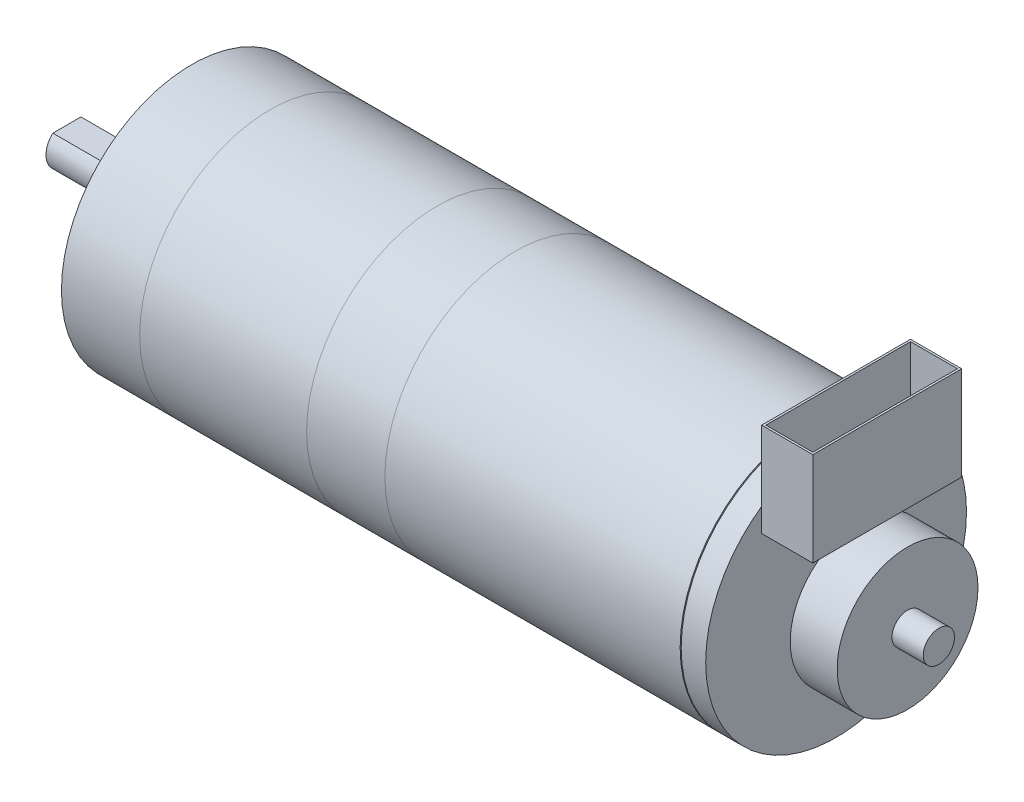
ISO-10303-21;
HEADER;
FILE_DESCRIPTION(('STEP AP214'),'2;1');
FILE_NAME('part.step','',(''),(''),'','','');
FILE_SCHEMA(('AUTOMOTIVE_DESIGN { 1 0 10303 214 1 1 1 1 }'));
ENDSEC;
DATA;
#1=APPLICATION_CONTEXT('core data for automotive mechanical design processes');
#2=APPLICATION_PROTOCOL_DEFINITION('international standard','automotive_design',2000,#1);
#3=PRODUCT_CONTEXT('',#1,'mechanical');
#4=PRODUCT('Part','Part','',(#3));
#5=PRODUCT_RELATED_PRODUCT_CATEGORY('part','',(#4));
#6=PRODUCT_DEFINITION_FORMATION('','',#4);
#7=PRODUCT_DEFINITION_CONTEXT('part definition',#1,'design');
#8=PRODUCT_DEFINITION('design','',#6,#7);
#9=PRODUCT_DEFINITION_SHAPE('','',#8);
#10=(LENGTH_UNIT() NAMED_UNIT(*) SI_UNIT(.MILLI.,.METRE.));
#11=(NAMED_UNIT(*) PLANE_ANGLE_UNIT() SI_UNIT($,.RADIAN.));
#12=(NAMED_UNIT(*) SI_UNIT($,.STERADIAN.) SOLID_ANGLE_UNIT());
#13=UNCERTAINTY_MEASURE_WITH_UNIT(LENGTH_MEASURE(1.E-05),#10,'distance_accuracy_value','');
#14=(GEOMETRIC_REPRESENTATION_CONTEXT(3) GLOBAL_UNCERTAINTY_ASSIGNED_CONTEXT((#13)) GLOBAL_UNIT_ASSIGNED_CONTEXT((#10,
#11,#12)) REPRESENTATION_CONTEXT('',''));
#15=CARTESIAN_POINT('',(0.,0.,0.));
#16=DIRECTION('',(0.,0.,1.));
#17=DIRECTION('',(1.,0.,0.));
#18=AXIS2_PLACEMENT_3D('',#15,#16,#17);
#19=CARTESIAN_POINT('',(0.,17.,0.));
#20=DIRECTION('',(0.,1.,0.));
#21=DIRECTION('',(0.,0.,1.));
#22=AXIS2_PLACEMENT_3D('',#19,#20,#21);
#23=PLANE('',#22);
#24=DIRECTION('',(-1.,0.,0.));
#25=VECTOR('',#24,1.);
#26=CARTESIAN_POINT('',(0.,17.,-7.13));
#27=LINE('',#26,#25);
#28=CARTESIAN_POINT('',(66.65,17.,-7.13));
#29=VERTEX_POINT('',#28);
#30=CARTESIAN_POINT('',(61.75,17.,-7.13));
#31=VERTEX_POINT('',#30);
#32=EDGE_CURVE('E179',#29,#31,#27,.T.);
#33=ORIENTED_EDGE('',*,*,#32,.T.);
#34=DIRECTION('',(0.,0.,1.));
#35=VECTOR('',#34,1.);
#36=CARTESIAN_POINT('',(61.75,17.,0.));
#37=LINE('',#36,#35);
#38=CARTESIAN_POINT('',(61.75,17.,7.13));
#39=VERTEX_POINT('',#38);
#40=EDGE_CURVE('E182',#31,#39,#37,.T.);
#41=ORIENTED_EDGE('',*,*,#40,.T.);
#42=DIRECTION('',(1.,0.,0.));
#43=VECTOR('',#42,1.);
#44=CARTESIAN_POINT('',(0.,17.,7.13));
#45=LINE('',#44,#43);
#46=CARTESIAN_POINT('',(66.65,17.,7.13));
#47=VERTEX_POINT('',#46);
#48=EDGE_CURVE('E185',#39,#47,#45,.T.);
#49=ORIENTED_EDGE('',*,*,#48,.T.);
#50=DIRECTION('',(0.,0.,-1.));
#51=VECTOR('',#50,1.);
#52=CARTESIAN_POINT('',(66.65,17.,0.));
#53=LINE('',#52,#51);
#54=EDGE_CURVE('E187',#47,#29,#53,.T.);
#55=ORIENTED_EDGE('',*,*,#54,.T.);
#56=EDGE_LOOP('',(#33,#41,#49,#55));
#57=FACE_BOUND('',#56,.T.);
#58=DIRECTION('',(0.,0.,1.));
#59=VECTOR('',#58,1.);
#60=CARTESIAN_POINT('',(61.95,17.,6.93));
#61=LINE('',#60,#59);
#62=CARTESIAN_POINT('',(61.95,17.,-6.93));
#63=VERTEX_POINT('',#62);
#64=CARTESIAN_POINT('',(61.95,17.,6.93));
#65=VERTEX_POINT('',#64);
#66=EDGE_CURVE('E151',#63,#65,#61,.T.);
#67=ORIENTED_EDGE('',*,*,#66,.F.);
#68=DIRECTION('',(-1.,0.,0.));
#69=VECTOR('',#68,1.);
#70=CARTESIAN_POINT('',(61.95,17.,-6.93));
#71=LINE('',#70,#69);
#72=CARTESIAN_POINT('',(66.45,17.,-6.93));
#73=VERTEX_POINT('',#72);
#74=EDGE_CURVE('E143',#73,#63,#71,.T.);
#75=ORIENTED_EDGE('',*,*,#74,.F.);
#76=DIRECTION('',(0.,0.,-1.));
#77=VECTOR('',#76,1.);
#78=CARTESIAN_POINT('',(66.45,17.,-6.93));
#79=LINE('',#78,#77);
#80=CARTESIAN_POINT('',(66.45,17.,6.93));
#81=VERTEX_POINT('',#80);
#82=EDGE_CURVE('E165',#81,#73,#79,.T.);
#83=ORIENTED_EDGE('',*,*,#82,.F.);
#84=DIRECTION('',(1.,0.,0.));
#85=VECTOR('',#84,1.);
#86=CARTESIAN_POINT('',(61.95,17.,6.93));
#87=LINE('',#86,#85);
#88=EDGE_CURVE('E163',#65,#81,#87,.T.);
#89=ORIENTED_EDGE('',*,*,#88,.F.);
#90=EDGE_LOOP('',(#67,#75,#83,#89));
#91=FACE_BOUND('',#90,.T.);
#92=ADVANCED_FACE('F78',(#57,#91),#23,.T.);
#93=CARTESIAN_POINT('',(0.,8.,0.));
#94=DIRECTION('',(0.,1.,0.));
#95=DIRECTION('',(0.,0.,1.));
#96=AXIS2_PLACEMENT_3D('',#93,#94,#95);
#97=PLANE('',#96);
#98=DIRECTION('',(-1.,0.,0.));
#99=VECTOR('',#98,1.);
#100=CARTESIAN_POINT('',(0.,8.,-7.13));
#101=LINE('',#100,#99);
#102=CARTESIAN_POINT('',(66.65,8.,-7.13));
#103=VERTEX_POINT('',#102);
#104=CARTESIAN_POINT('',(61.75,8.,-7.13));
#105=VERTEX_POINT('',#104);
#106=EDGE_CURVE('E159',#103,#105,#101,.T.);
#107=ORIENTED_EDGE('',*,*,#106,.F.);
#108=DIRECTION('',(0.,0.,-1.));
#109=VECTOR('',#108,1.);
#110=CARTESIAN_POINT('',(66.65,8.,0.));
#111=LINE('',#110,#109);
#112=CARTESIAN_POINT('',(66.65,8.,7.13));
#113=VERTEX_POINT('',#112);
#114=EDGE_CURVE('E183',#113,#103,#111,.T.);
#115=ORIENTED_EDGE('',*,*,#114,.F.);
#116=DIRECTION('',(1.,0.,0.));
#117=VECTOR('',#116,1.);
#118=CARTESIAN_POINT('',(0.,8.,7.13));
#119=LINE('',#118,#117);
#120=CARTESIAN_POINT('',(61.75,8.,7.13));
#121=VERTEX_POINT('',#120);
#122=EDGE_CURVE('E194',#121,#113,#119,.T.);
#123=ORIENTED_EDGE('',*,*,#122,.F.);
#124=DIRECTION('',(0.,0.,1.));
#125=VECTOR('',#124,1.);
#126=CARTESIAN_POINT('',(61.75,8.,0.));
#127=LINE('',#126,#125);
#128=EDGE_CURVE('E192',#105,#121,#127,.T.);
#129=ORIENTED_EDGE('',*,*,#128,.F.);
#130=EDGE_LOOP('',(#107,#115,#123,#129));
#131=FACE_BOUND('',#130,.T.);
#132=DIRECTION('',(-1.,0.,0.));
#133=VECTOR('',#132,1.);
#134=CARTESIAN_POINT('',(61.95,8.,-6.93));
#135=LINE('',#134,#133);
#136=CARTESIAN_POINT('',(66.45,8.,-6.93));
#137=VERTEX_POINT('',#136);
#138=CARTESIAN_POINT('',(61.95,8.,-6.93));
#139=VERTEX_POINT('',#138);
#140=EDGE_CURVE('E101',#137,#139,#135,.T.);
#141=ORIENTED_EDGE('',*,*,#140,.T.);
#142=DIRECTION('',(0.,0.,1.));
#143=VECTOR('',#142,1.);
#144=CARTESIAN_POINT('',(61.95,8.,6.93));
#145=LINE('',#144,#143);
#146=CARTESIAN_POINT('',(61.95,8.,6.93));
#147=VERTEX_POINT('',#146);
#148=EDGE_CURVE('E158',#139,#147,#145,.T.);
#149=ORIENTED_EDGE('',*,*,#148,.T.);
#150=DIRECTION('',(1.,0.,0.));
#151=VECTOR('',#150,1.);
#152=CARTESIAN_POINT('',(61.95,8.,6.93));
#153=LINE('',#152,#151);
#154=CARTESIAN_POINT('',(66.45,8.,6.93));
#155=VERTEX_POINT('',#154);
#156=EDGE_CURVE('E171',#147,#155,#153,.T.);
#157=ORIENTED_EDGE('',*,*,#156,.T.);
#158=DIRECTION('',(0.,0.,-1.));
#159=VECTOR('',#158,1.);
#160=CARTESIAN_POINT('',(66.45,8.,-6.93));
#161=LINE('',#160,#159);
#162=EDGE_CURVE('E152',#155,#137,#161,.T.);
#163=ORIENTED_EDGE('',*,*,#162,.T.);
#164=EDGE_LOOP('',(#141,#149,#157,#163));
#165=FACE_BOUND('',#164,.T.);
#166=ADVANCED_FACE('F212',(#131,#165),#97,.F.);
#167=CARTESIAN_POINT('',(0.,17.,-7.13));
#168=DIRECTION('',(0.,0.,1.));
#169=DIRECTION('',(1.,0.,0.));
#170=AXIS2_PLACEMENT_3D('',#167,#168,#169);
#171=PLANE('',#170);
#172=ORIENTED_EDGE('',*,*,#106,.T.);
#173=DIRECTION('',(0.,-1.,0.));
#174=VECTOR('',#173,1.);
#175=CARTESIAN_POINT('',(61.75,17.,-7.13));
#176=LINE('',#175,#174);
#177=EDGE_CURVE('E13',#31,#105,#176,.T.);
#178=ORIENTED_EDGE('',*,*,#177,.F.);
#179=ORIENTED_EDGE('',*,*,#32,.F.);
#180=DIRECTION('',(0.,-1.,0.));
#181=VECTOR('',#180,1.);
#182=CARTESIAN_POINT('',(66.65,17.,-7.13));
#183=LINE('',#182,#181);
#184=EDGE_CURVE('E189',#29,#103,#183,.T.);
#185=ORIENTED_EDGE('',*,*,#184,.T.);
#186=EDGE_LOOP('',(#172,#178,#179,#185));
#187=FACE_BOUND('',#186,.T.);
#188=ADVANCED_FACE('F80',(#187),#171,.F.);
#189=CARTESIAN_POINT('',(61.75,17.,0.));
#190=DIRECTION('',(1.,0.,0.));
#191=DIRECTION('',(0.,0.,-1.));
#192=AXIS2_PLACEMENT_3D('',#189,#190,#191);
#193=PLANE('',#192);
#194=ORIENTED_EDGE('',*,*,#128,.T.);
#195=DIRECTION('',(0.,-1.,0.));
#196=VECTOR('',#195,1.);
#197=CARTESIAN_POINT('',(61.75,17.,7.13));
#198=LINE('',#197,#196);
#199=EDGE_CURVE('E86',#39,#121,#198,.T.);
#200=ORIENTED_EDGE('',*,*,#199,.F.);
#201=ORIENTED_EDGE('',*,*,#40,.F.);
#202=ORIENTED_EDGE('',*,*,#177,.T.);
#203=EDGE_LOOP('',(#194,#200,#201,#202));
#204=FACE_BOUND('',#203,.T.);
#205=ADVANCED_FACE('F222',(#204),#193,.F.);
#206=CARTESIAN_POINT('',(0.,17.,7.13));
#207=DIRECTION('',(0.,0.,-1.));
#208=DIRECTION('',(-1.,0.,0.));
#209=AXIS2_PLACEMENT_3D('',#206,#207,#208);
#210=PLANE('',#209);
#211=ORIENTED_EDGE('',*,*,#122,.T.);
#212=DIRECTION('',(0.,-1.,0.));
#213=VECTOR('',#212,1.);
#214=CARTESIAN_POINT('',(66.65,17.,7.13));
#215=LINE('',#214,#213);
#216=EDGE_CURVE('E199',#47,#113,#215,.T.);
#217=ORIENTED_EDGE('',*,*,#216,.F.);
#218=ORIENTED_EDGE('',*,*,#48,.F.);
#219=ORIENTED_EDGE('',*,*,#199,.T.);
#220=EDGE_LOOP('',(#211,#217,#218,#219));
#221=FACE_BOUND('',#220,.T.);
#222=ADVANCED_FACE('F206',(#221),#210,.F.);
#223=CARTESIAN_POINT('',(66.65,17.,0.));
#224=DIRECTION('',(-1.,0.,0.));
#225=DIRECTION('',(0.,0.,1.));
#226=AXIS2_PLACEMENT_3D('',#223,#224,#225);
#227=PLANE('',#226);
#228=ORIENTED_EDGE('',*,*,#114,.T.);
#229=ORIENTED_EDGE('',*,*,#184,.F.);
#230=ORIENTED_EDGE('',*,*,#54,.F.);
#231=ORIENTED_EDGE('',*,*,#216,.T.);
#232=EDGE_LOOP('',(#228,#229,#230,#231));
#233=FACE_BOUND('',#232,.T.);
#234=ADVANCED_FACE('F216',(#233),#227,.F.);
#235=CARTESIAN_POINT('',(61.95,17.,-6.93));
#236=DIRECTION('',(0.,0.,1.));
#237=DIRECTION('',(1.,0.,0.));
#238=AXIS2_PLACEMENT_3D('',#235,#236,#237);
#239=PLANE('',#238);
#240=ORIENTED_EDGE('',*,*,#140,.F.);
#241=DIRECTION('',(0.,-1.,0.));
#242=VECTOR('',#241,1.);
#243=CARTESIAN_POINT('',(66.45,17.,-6.93));
#244=LINE('',#243,#242);
#245=EDGE_CURVE('E147',#73,#137,#244,.T.);
#246=ORIENTED_EDGE('',*,*,#245,.F.);
#247=ORIENTED_EDGE('',*,*,#74,.T.);
#248=DIRECTION('',(0.,-1.,0.));
#249=VECTOR('',#248,1.);
#250=CARTESIAN_POINT('',(61.95,17.,-6.93));
#251=LINE('',#250,#249);
#252=EDGE_CURVE('E146',#63,#139,#251,.T.);
#253=ORIENTED_EDGE('',*,*,#252,.T.);
#254=EDGE_LOOP('',(#240,#246,#247,#253));
#255=FACE_BOUND('',#254,.T.);
#256=ADVANCED_FACE('F145',(#255),#239,.T.);
#257=CARTESIAN_POINT('',(61.95,17.,6.93));
#258=DIRECTION('',(1.,0.,0.));
#259=DIRECTION('',(0.,0.,-1.));
#260=AXIS2_PLACEMENT_3D('',#257,#258,#259);
#261=PLANE('',#260);
#262=ORIENTED_EDGE('',*,*,#148,.F.);
#263=ORIENTED_EDGE('',*,*,#252,.F.);
#264=ORIENTED_EDGE('',*,*,#66,.T.);
#265=DIRECTION('',(0.,-1.,0.));
#266=VECTOR('',#265,1.);
#267=CARTESIAN_POINT('',(61.95,17.,6.93));
#268=LINE('',#267,#266);
#269=EDGE_CURVE('E160',#65,#147,#268,.T.);
#270=ORIENTED_EDGE('',*,*,#269,.T.);
#271=EDGE_LOOP('',(#262,#263,#264,#270));
#272=FACE_BOUND('',#271,.T.);
#273=ADVANCED_FACE('F155',(#272),#261,.T.);
#274=CARTESIAN_POINT('',(61.95,17.,6.93));
#275=DIRECTION('',(0.,0.,-1.));
#276=DIRECTION('',(-1.,0.,0.));
#277=AXIS2_PLACEMENT_3D('',#274,#275,#276);
#278=PLANE('',#277);
#279=ORIENTED_EDGE('',*,*,#156,.F.);
#280=ORIENTED_EDGE('',*,*,#269,.F.);
#281=ORIENTED_EDGE('',*,*,#88,.T.);
#282=DIRECTION('',(0.,-1.,0.));
#283=VECTOR('',#282,1.);
#284=CARTESIAN_POINT('',(66.45,17.,6.93));
#285=LINE('',#284,#283);
#286=EDGE_CURVE('E93',#81,#155,#285,.T.);
#287=ORIENTED_EDGE('',*,*,#286,.T.);
#288=EDGE_LOOP('',(#279,#280,#281,#287));
#289=FACE_BOUND('',#288,.T.);
#290=ADVANCED_FACE('F245',(#289),#278,.T.);
#291=CARTESIAN_POINT('',(66.45,17.,-6.93));
#292=DIRECTION('',(-1.,0.,0.));
#293=DIRECTION('',(0.,0.,1.));
#294=AXIS2_PLACEMENT_3D('',#291,#292,#293);
#295=PLANE('',#294);
#296=ORIENTED_EDGE('',*,*,#162,.F.);
#297=ORIENTED_EDGE('',*,*,#286,.F.);
#298=ORIENTED_EDGE('',*,*,#82,.T.);
#299=ORIENTED_EDGE('',*,*,#245,.T.);
#300=EDGE_LOOP('',(#296,#297,#298,#299));
#301=FACE_BOUND('',#300,.T.);
#302=ADVANCED_FACE('F249',(#301),#295,.T.);
#303=CLOSED_SHELL('',(#92,#166,#188,#205,#222,#234,#256,#273,#290,#302));
#304=MANIFOLD_SOLID_BREP('B2',#303);
#305=CARTESIAN_POINT('',(59.3,0.,0.));
#306=DIRECTION('',(-1.,0.,0.));
#307=DIRECTION('',(0.,0.,1.));
#308=AXIS2_PLACEMENT_3D('',#305,#306,#307);
#309=CYLINDRICAL_SURFACE('',#308,12.5);
#310=CARTESIAN_POINT('',(59.3,0.,0.));
#311=DIRECTION('',(1.,0.,0.));
#312=DIRECTION('',(0.,0.,-1.));
#313=AXIS2_PLACEMENT_3D('',#310,#311,#312);
#314=CIRCLE('',#313,12.5);
#315=CARTESIAN_POINT('',(59.3,0.,-12.5));
#316=VERTEX_POINT('',#315);
#317=EDGE_CURVE('E323',#316,#316,#314,.T.);
#318=ORIENTED_EDGE('',*,*,#317,.F.);
#319=EDGE_LOOP('',(#318));
#320=FACE_BOUND('',#319,.T.);
#321=CARTESIAN_POINT('',(31.,0.,0.));
#322=DIRECTION('',(1.,0.,0.));
#323=DIRECTION('',(0.,0.,-1.));
#324=AXIS2_PLACEMENT_3D('',#321,#322,#323);
#325=CIRCLE('',#324,12.5);
#326=CARTESIAN_POINT('',(31.,0.,-12.5));
#327=VERTEX_POINT('',#326);
#328=EDGE_CURVE('E319',#327,#327,#325,.T.);
#329=ORIENTED_EDGE('',*,*,#328,.T.);
#330=EDGE_LOOP('',(#329));
#331=FACE_BOUND('',#330,.T.);
#332=ADVANCED_FACE('F316',(#320,#331),#309,.T.);
#333=CARTESIAN_POINT('',(59.3,0.,0.));
#334=DIRECTION('',(1.,0.,0.));
#335=DIRECTION('',(0.,0.,-1.));
#336=AXIS2_PLACEMENT_3D('',#333,#334,#335);
#337=PLANE('',#336);
#338=CARTESIAN_POINT('',(59.3,0.,0.));
#339=DIRECTION('',(1.,0.,0.));
#340=DIRECTION('',(0.,0.,-1.));
#341=AXIS2_PLACEMENT_3D('',#338,#339,#340);
#342=CIRCLE('',#341,1.5);
#343=CARTESIAN_POINT('',(59.3,0.,-1.5));
#344=VERTEX_POINT('',#343);
#345=EDGE_CURVE('E347',#344,#344,#342,.T.);
#346=ORIENTED_EDGE('',*,*,#345,.F.);
#347=EDGE_LOOP('',(#346));
#348=FACE_BOUND('',#347,.T.);
#349=ORIENTED_EDGE('',*,*,#317,.T.);
#350=EDGE_LOOP('',(#349));
#351=FACE_BOUND('',#350,.T.);
#352=ADVANCED_FACE('F358',(#348,#351),#337,.T.);
#353=CARTESIAN_POINT('',(31.,0.,0.));
#354=DIRECTION('',(1.,0.,0.));
#355=DIRECTION('',(0.,0.,-1.));
#356=AXIS2_PLACEMENT_3D('',#353,#354,#355);
#357=PLANE('',#356);
#358=ORIENTED_EDGE('',*,*,#328,.F.);
#359=EDGE_LOOP('',(#358));
#360=FACE_BOUND('',#359,.T.);
#361=ADVANCED_FACE('F361',(#360),#357,.F.);
#362=CARTESIAN_POINT('',(59.4,0.,0.));
#363=DIRECTION('',(-1.,0.,0.));
#364=DIRECTION('',(0.,0.,1.));
#365=AXIS2_PLACEMENT_3D('',#362,#363,#364);
#366=CYLINDRICAL_SURFACE('',#365,1.5);
#367=CARTESIAN_POINT('',(59.4,0.,0.));
#368=DIRECTION('',(1.,0.,0.));
#369=DIRECTION('',(0.,0.,-1.));
#370=AXIS2_PLACEMENT_3D('',#367,#368,#369);
#371=CIRCLE('',#370,1.5);
#372=CARTESIAN_POINT('',(59.4,0.,-1.5));
#373=VERTEX_POINT('',#372);
#374=EDGE_CURVE('E350',#373,#373,#371,.T.);
#375=ORIENTED_EDGE('',*,*,#374,.F.);
#376=EDGE_LOOP('',(#375));
#377=FACE_BOUND('',#376,.T.);
#378=ORIENTED_EDGE('',*,*,#345,.T.);
#379=EDGE_LOOP('',(#378));
#380=FACE_BOUND('',#379,.T.);
#381=ADVANCED_FACE('F356',(#377,#380),#366,.T.);
#382=CARTESIAN_POINT('',(61.75,0.,0.));
#383=DIRECTION('',(-1.,0.,0.));
#384=DIRECTION('',(0.,0.,1.));
#385=AXIS2_PLACEMENT_3D('',#382,#383,#384);
#386=CYLINDRICAL_SURFACE('',#385,12.5);
#387=CARTESIAN_POINT('',(61.75,0.,0.));
#388=DIRECTION('',(1.,0.,0.));
#389=DIRECTION('',(0.,0.,-1.));
#390=AXIS2_PLACEMENT_3D('',#387,#388,#389);
#391=CIRCLE('',#390,12.5);
#392=CARTESIAN_POINT('',(61.75,0.,-12.5));
#393=VERTEX_POINT('',#392);
#394=EDGE_CURVE('E344',#393,#393,#391,.T.);
#395=ORIENTED_EDGE('',*,*,#394,.F.);
#396=EDGE_LOOP('',(#395));
#397=FACE_BOUND('',#396,.T.);
#398=CARTESIAN_POINT('',(59.4,0.,0.));
#399=DIRECTION('',(1.,0.,0.));
#400=DIRECTION('',(0.,0.,-1.));
#401=AXIS2_PLACEMENT_3D('',#398,#399,#400);
#402=CIRCLE('',#401,12.5);
#403=CARTESIAN_POINT('',(59.4,0.,-12.5));
#404=VERTEX_POINT('',#403);
#405=EDGE_CURVE('E341',#404,#404,#402,.T.);
#406=ORIENTED_EDGE('',*,*,#405,.T.);
#407=EDGE_LOOP('',(#406));
#408=FACE_BOUND('',#407,.T.);
#409=ADVANCED_FACE('F374',(#397,#408),#386,.T.);
#410=CARTESIAN_POINT('',(61.75,0.,0.));
#411=DIRECTION('',(1.,0.,0.));
#412=DIRECTION('',(0.,0.,-1.));
#413=AXIS2_PLACEMENT_3D('',#410,#411,#412);
#414=PLANE('',#413);
#415=CARTESIAN_POINT('',(61.75,0.,0.));
#416=DIRECTION('',(1.,0.,0.));
#417=DIRECTION('',(0.,0.,-1.));
#418=AXIS2_PLACEMENT_3D('',#415,#416,#417);
#419=CIRCLE('',#418,1.5);
#420=CARTESIAN_POINT('',(61.75,0.,-1.5));
#421=VERTEX_POINT('',#420);
#422=EDGE_CURVE('E334',#421,#421,#419,.T.);
#423=ORIENTED_EDGE('',*,*,#422,.F.);
#424=EDGE_LOOP('',(#423));
#425=FACE_BOUND('',#424,.T.);
#426=ORIENTED_EDGE('',*,*,#394,.T.);
#427=EDGE_LOOP('',(#426));
#428=FACE_BOUND('',#427,.T.);
#429=ADVANCED_FACE('F380',(#425,#428),#414,.T.);
#430=CARTESIAN_POINT('',(59.4,0.,0.));
#431=DIRECTION('',(1.,0.,0.));
#432=DIRECTION('',(0.,0.,-1.));
#433=AXIS2_PLACEMENT_3D('',#430,#431,#432);
#434=PLANE('',#433);
#435=ORIENTED_EDGE('',*,*,#374,.T.);
#436=EDGE_LOOP('',(#435));
#437=FACE_BOUND('',#436,.T.);
#438=ORIENTED_EDGE('',*,*,#405,.F.);
#439=EDGE_LOOP('',(#438));
#440=FACE_BOUND('',#439,.T.);
#441=ADVANCED_FACE('F382',(#437,#440),#434,.F.);
#442=CARTESIAN_POINT('',(64.1,0.,0.));
#443=DIRECTION('',(-1.,0.,0.));
#444=DIRECTION('',(0.,0.,1.));
#445=AXIS2_PLACEMENT_3D('',#442,#443,#444);
#446=CYLINDRICAL_SURFACE('',#445,1.5);
#447=CARTESIAN_POINT('',(64.1,0.,0.));
#448=DIRECTION('',(1.,0.,0.));
#449=DIRECTION('',(0.,0.,-1.));
#450=AXIS2_PLACEMENT_3D('',#447,#448,#449);
#451=CIRCLE('',#450,1.5);
#452=CARTESIAN_POINT('',(64.1,0.,-1.5));
#453=VERTEX_POINT('',#452);
#454=EDGE_CURVE('E338',#453,#453,#451,.T.);
#455=ORIENTED_EDGE('',*,*,#454,.F.);
#456=EDGE_LOOP('',(#455));
#457=FACE_BOUND('',#456,.T.);
#458=ORIENTED_EDGE('',*,*,#422,.T.);
#459=EDGE_LOOP('',(#458));
#460=FACE_BOUND('',#459,.T.);
#461=ADVANCED_FACE('F385',(#457,#460),#446,.T.);
#462=CARTESIAN_POINT('',(68.6,0.,0.));
#463=DIRECTION('',(-1.,0.,0.));
#464=DIRECTION('',(0.,0.,1.));
#465=AXIS2_PLACEMENT_3D('',#462,#463,#464);
#466=CYLINDRICAL_SURFACE('',#465,6.75);
#467=CARTESIAN_POINT('',(68.6,0.,0.));
#468=DIRECTION('',(1.,0.,0.));
#469=DIRECTION('',(0.,0.,-1.));
#470=AXIS2_PLACEMENT_3D('',#467,#468,#469);
#471=CIRCLE('',#470,6.75);
#472=CARTESIAN_POINT('',(68.6,0.,-6.75));
#473=VERTEX_POINT('',#472);
#474=EDGE_CURVE('E331',#473,#473,#471,.T.);
#475=ORIENTED_EDGE('',*,*,#474,.F.);
#476=EDGE_LOOP('',(#475));
#477=FACE_BOUND('',#476,.T.);
#478=CARTESIAN_POINT('',(64.1,0.,0.));
#479=DIRECTION('',(1.,0.,0.));
#480=DIRECTION('',(0.,0.,-1.));
#481=AXIS2_PLACEMENT_3D('',#478,#479,#480);
#482=CIRCLE('',#481,6.75);
#483=CARTESIAN_POINT('',(64.1,0.,-6.75));
#484=VERTEX_POINT('',#483);
#485=EDGE_CURVE('E335',#484,#484,#482,.T.);
#486=ORIENTED_EDGE('',*,*,#485,.T.);
#487=EDGE_LOOP('',(#486));
#488=FACE_BOUND('',#487,.T.);
#489=ADVANCED_FACE('F392',(#477,#488),#466,.T.);
#490=CARTESIAN_POINT('',(68.6,0.,0.));
#491=DIRECTION('',(1.,0.,0.));
#492=DIRECTION('',(0.,0.,-1.));
#493=AXIS2_PLACEMENT_3D('',#490,#491,#492);
#494=PLANE('',#493);
#495=CARTESIAN_POINT('',(68.6,0.,0.));
#496=DIRECTION('',(1.,0.,0.));
#497=DIRECTION('',(0.,0.,-1.));
#498=AXIS2_PLACEMENT_3D('',#495,#496,#497);
#499=CIRCLE('',#498,1.5);
#500=CARTESIAN_POINT('',(68.6,0.,-1.5));
#501=VERTEX_POINT('',#500);
#502=EDGE_CURVE('E77',#501,#501,#499,.T.);
#503=ORIENTED_EDGE('',*,*,#502,.F.);
#504=EDGE_LOOP('',(#503));
#505=FACE_BOUND('',#504,.T.);
#506=ORIENTED_EDGE('',*,*,#474,.T.);
#507=EDGE_LOOP('',(#506));
#508=FACE_BOUND('',#507,.T.);
#509=ADVANCED_FACE('F396',(#505,#508),#494,.T.);
#510=CARTESIAN_POINT('',(64.1,0.,0.));
#511=DIRECTION('',(1.,0.,0.));
#512=DIRECTION('',(0.,0.,-1.));
#513=AXIS2_PLACEMENT_3D('',#510,#511,#512);
#514=PLANE('',#513);
#515=ORIENTED_EDGE('',*,*,#454,.T.);
#516=EDGE_LOOP('',(#515));
#517=FACE_BOUND('',#516,.T.);
#518=ORIENTED_EDGE('',*,*,#485,.F.);
#519=EDGE_LOOP('',(#518));
#520=FACE_BOUND('',#519,.T.);
#521=ADVANCED_FACE('F398',(#517,#520),#514,.F.);
#522=CARTESIAN_POINT('',(71.6,0.,0.));
#523=DIRECTION('',(-1.,0.,0.));
#524=DIRECTION('',(0.,0.,1.));
#525=AXIS2_PLACEMENT_3D('',#522,#523,#524);
#526=CYLINDRICAL_SURFACE('',#525,1.5);
#527=CARTESIAN_POINT('',(71.6,0.,0.));
#528=DIRECTION('',(1.,0.,0.));
#529=DIRECTION('',(0.,0.,-1.));
#530=AXIS2_PLACEMENT_3D('',#527,#528,#529);
#531=CIRCLE('',#530,1.5);
#532=CARTESIAN_POINT('',(71.6,0.,-1.5));
#533=VERTEX_POINT('',#532);
#534=EDGE_CURVE('E330',#533,#533,#531,.T.);
#535=ORIENTED_EDGE('',*,*,#534,.F.);
#536=EDGE_LOOP('',(#535));
#537=FACE_BOUND('',#536,.T.);
#538=ORIENTED_EDGE('',*,*,#502,.T.);
#539=EDGE_LOOP('',(#538));
#540=FACE_BOUND('',#539,.T.);
#541=ADVANCED_FACE('F401',(#537,#540),#526,.T.);
#542=CARTESIAN_POINT('',(71.6,0.,0.));
#543=DIRECTION('',(1.,0.,0.));
#544=DIRECTION('',(0.,0.,-1.));
#545=AXIS2_PLACEMENT_3D('',#542,#543,#544);
#546=PLANE('',#545);
#547=ORIENTED_EDGE('',*,*,#534,.T.);
#548=EDGE_LOOP('',(#547));
#549=FACE_BOUND('',#548,.T.);
#550=ADVANCED_FACE('F408',(#549),#546,.T.);
#551=CLOSED_SHELL('',(#332,#352,#361,#381,#409,#429,#441,#461,#489,#509,#521,#541,#550));
#552=MANIFOLD_SOLID_BREP('B7',#551);
#553=CARTESIAN_POINT('',(31.,0.,0.));
#554=DIRECTION('',(-1.,0.,0.));
#555=DIRECTION('',(0.,0.,1.));
#556=AXIS2_PLACEMENT_3D('',#553,#554,#555);
#557=CYLINDRICAL_SURFACE('',#556,12.5);
#558=CARTESIAN_POINT('',(31.,0.,0.));
#559=DIRECTION('',(1.,0.,0.));
#560=DIRECTION('',(0.,0.,-1.));
#561=AXIS2_PLACEMENT_3D('',#558,#559,#560);
#562=CIRCLE('',#561,12.5);
#563=CARTESIAN_POINT('',(31.,0.,-12.5));
#564=VERTEX_POINT('',#563);
#565=EDGE_CURVE('E315',#564,#564,#562,.T.);
#566=ORIENTED_EDGE('',*,*,#565,.F.);
#567=EDGE_LOOP('',(#566));
#568=FACE_BOUND('',#567,.T.);
#569=CARTESIAN_POINT('',(23.5,0.,0.));
#570=DIRECTION('',(1.,0.,0.));
#571=DIRECTION('',(0.,0.,-1.));
#572=AXIS2_PLACEMENT_3D('',#569,#570,#571);
#573=CIRCLE('',#572,12.5);
#574=CARTESIAN_POINT('',(23.5,0.,-12.5));
#575=VERTEX_POINT('',#574);
#576=EDGE_CURVE('E542',#575,#575,#573,.T.);
#577=ORIENTED_EDGE('',*,*,#576,.T.);
#578=EDGE_LOOP('',(#577));
#579=FACE_BOUND('',#578,.T.);
#580=ADVANCED_FACE('F539',(#568,#579),#557,.T.);
#581=CARTESIAN_POINT('',(31.,0.,0.));
#582=DIRECTION('',(1.,0.,0.));
#583=DIRECTION('',(0.,0.,-1.));
#584=AXIS2_PLACEMENT_3D('',#581,#582,#583);
#585=PLANE('',#584);
#586=ORIENTED_EDGE('',*,*,#565,.T.);
#587=EDGE_LOOP('',(#586));
#588=FACE_BOUND('',#587,.T.);
#589=ADVANCED_FACE('F554',(#588),#585,.T.);
#590=CARTESIAN_POINT('',(23.5,0.,0.));
#591=DIRECTION('',(1.,0.,0.));
#592=DIRECTION('',(0.,0.,-1.));
#593=AXIS2_PLACEMENT_3D('',#590,#591,#592);
#594=PLANE('',#593);
#595=ORIENTED_EDGE('',*,*,#576,.F.);
#596=EDGE_LOOP('',(#595));
#597=FACE_BOUND('',#596,.T.);
#598=ADVANCED_FACE('F552',(#597),#594,.F.);
#599=CLOSED_SHELL('',(#580,#589,#598));
#600=MANIFOLD_SOLID_BREP('B72',#599);
#601=CARTESIAN_POINT('',(23.5,0.,0.));
#602=DIRECTION('',(-1.,0.,0.));
#603=DIRECTION('',(0.,0.,1.));
#604=AXIS2_PLACEMENT_3D('',#601,#602,#603);
#605=CYLINDRICAL_SURFACE('',#604,12.5);
#606=CARTESIAN_POINT('',(23.5,0.,0.));
#607=DIRECTION('',(1.,0.,0.));
#608=DIRECTION('',(0.,0.,-1.));
#609=AXIS2_PLACEMENT_3D('',#606,#607,#608);
#610=CIRCLE('',#609,12.5);
#611=CARTESIAN_POINT('',(23.5,0.,-12.5));
#612=VERTEX_POINT('',#611);
#613=EDGE_CURVE('E538',#612,#612,#610,.T.);
#614=ORIENTED_EDGE('',*,*,#613,.F.);
#615=EDGE_LOOP('',(#614));
#616=FACE_BOUND('',#615,.T.);
#617=CARTESIAN_POINT('',(7.5,0.,0.));
#618=DIRECTION('',(1.,0.,0.));
#619=DIRECTION('',(0.,0.,-1.));
#620=AXIS2_PLACEMENT_3D('',#617,#618,#619);
#621=CIRCLE('',#620,12.5);
#622=CARTESIAN_POINT('',(7.5,0.,-12.5));
#623=VERTEX_POINT('',#622);
#624=EDGE_CURVE('E592',#623,#623,#621,.T.);
#625=ORIENTED_EDGE('',*,*,#624,.T.);
#626=EDGE_LOOP('',(#625));
#627=FACE_BOUND('',#626,.T.);
#628=ADVANCED_FACE('F589',(#616,#627),#605,.T.);
#629=CARTESIAN_POINT('',(23.5,0.,0.));
#630=DIRECTION('',(1.,0.,0.));
#631=DIRECTION('',(0.,0.,-1.));
#632=AXIS2_PLACEMENT_3D('',#629,#630,#631);
#633=PLANE('',#632);
#634=ORIENTED_EDGE('',*,*,#613,.T.);
#635=EDGE_LOOP('',(#634));
#636=FACE_BOUND('',#635,.T.);
#637=ADVANCED_FACE('F604',(#636),#633,.T.);
#638=CARTESIAN_POINT('',(7.5,0.,0.));
#639=DIRECTION('',(1.,0.,0.));
#640=DIRECTION('',(0.,0.,-1.));
#641=AXIS2_PLACEMENT_3D('',#638,#639,#640);
#642=PLANE('',#641);
#643=ORIENTED_EDGE('',*,*,#624,.F.);
#644=EDGE_LOOP('',(#643));
#645=FACE_BOUND('',#644,.T.);
#646=ADVANCED_FACE('F602',(#645),#642,.F.);
#647=CLOSED_SHELL('',(#628,#637,#646));
#648=MANIFOLD_SOLID_BREP('B310',#647);
#649=CARTESIAN_POINT('',(7.5,0.,0.));
#650=DIRECTION('',(-1.,0.,0.));
#651=DIRECTION('',(0.,0.,1.));
#652=AXIS2_PLACEMENT_3D('',#649,#650,#651);
#653=CYLINDRICAL_SURFACE('',#652,12.5);
#654=CARTESIAN_POINT('',(7.5,0.,0.));
#655=DIRECTION('',(1.,0.,0.));
#656=DIRECTION('',(0.,0.,-1.));
#657=AXIS2_PLACEMENT_3D('',#654,#655,#656);
#658=CIRCLE('',#657,12.5);
#659=CARTESIAN_POINT('',(7.5,0.,-12.5));
#660=VERTEX_POINT('',#659);
#661=EDGE_CURVE('E682',#660,#660,#658,.T.);
#662=ORIENTED_EDGE('',*,*,#661,.F.);
#663=EDGE_LOOP('',(#662));
#664=FACE_BOUND('',#663,.T.);
#665=CARTESIAN_POINT('',(0.,0.,0.));
#666=DIRECTION('',(1.,0.,0.));
#667=DIRECTION('',(0.,0.,-1.));
#668=AXIS2_PLACEMENT_3D('',#665,#666,#667);
#669=CIRCLE('',#668,12.5);
#670=CARTESIAN_POINT('',(0.,0.,-12.5));
#671=VERTEX_POINT('',#670);
#672=EDGE_CURVE('E673',#671,#671,#669,.T.);
#673=ORIENTED_EDGE('',*,*,#672,.T.);
#674=EDGE_LOOP('',(#673));
#675=FACE_BOUND('',#674,.T.);
#676=ADVANCED_FACE('F630',(#664,#675),#653,.T.);
#677=CARTESIAN_POINT('',(7.5,0.,0.));
#678=DIRECTION('',(1.,0.,0.));
#679=DIRECTION('',(0.,0.,-1.));
#680=AXIS2_PLACEMENT_3D('',#677,#678,#679);
#681=PLANE('',#680);
#682=ORIENTED_EDGE('',*,*,#661,.T.);
#683=EDGE_LOOP('',(#682));
#684=FACE_BOUND('',#683,.T.);
#685=ADVANCED_FACE('F691',(#684),#681,.T.);
#686=CARTESIAN_POINT('',(0.,0.,0.));
#687=DIRECTION('',(1.,0.,0.));
#688=DIRECTION('',(0.,0.,-1.));
#689=AXIS2_PLACEMENT_3D('',#686,#687,#688);
#690=PLANE('',#689);
#691=CARTESIAN_POINT('',(0.,0.,-8.5));
#692=DIRECTION('',(1.,0.,0.));
#693=DIRECTION('',(0.,0.,-1.));
#694=AXIS2_PLACEMENT_3D('',#691,#692,#693);
#695=CIRCLE('',#694,1.75);
#696=CARTESIAN_POINT('',(0.,0.,-10.25));
#697=VERTEX_POINT('',#696);
#698=EDGE_CURVE('E802',#697,#697,#695,.T.);
#699=ORIENTED_EDGE('',*,*,#698,.T.);
#700=EDGE_LOOP('',(#699));
#701=FACE_BOUND('',#700,.T.);
#702=CARTESIAN_POINT('',(0.,0.,8.5));
#703=DIRECTION('',(-1.,0.,0.));
#704=DIRECTION('',(0.,0.,1.));
#705=AXIS2_PLACEMENT_3D('',#702,#703,#704);
#706=CIRCLE('',#705,1.75);
#707=CARTESIAN_POINT('',(0.,0.,10.25));
#708=VERTEX_POINT('',#707);
#709=EDGE_CURVE('E801',#708,#708,#706,.T.);
#710=ORIENTED_EDGE('',*,*,#709,.F.);
#711=EDGE_LOOP('',(#710));
#712=FACE_BOUND('',#711,.T.);
#713=CARTESIAN_POINT('',(0.,0.,0.));
#714=DIRECTION('',(-1.,0.,0.));
#715=DIRECTION('',(0.,0.,1.));
#716=AXIS2_PLACEMENT_3D('',#713,#714,#715);
#717=CIRCLE('',#716,3.5);
#718=CARTESIAN_POINT('',(0.,0.,3.5));
#719=VERTEX_POINT('',#718);
#720=EDGE_CURVE('E678',#719,#719,#717,.T.);
#721=ORIENTED_EDGE('',*,*,#720,.F.);
#722=EDGE_LOOP('',(#721));
#723=FACE_BOUND('',#722,.T.);
#724=ORIENTED_EDGE('',*,*,#672,.F.);
#725=EDGE_LOOP('',(#724));
#726=FACE_BOUND('',#725,.T.);
#727=ADVANCED_FACE('F688',(#701,#712,#723,#726),#690,.F.);
#728=CARTESIAN_POINT('',(-2.38,0.,0.));
#729=DIRECTION('',(1.,0.,0.));
#730=DIRECTION('',(0.,0.,-1.));
#731=AXIS2_PLACEMENT_3D('',#728,#729,#730);
#732=CYLINDRICAL_SURFACE('',#731,3.5);
#733=CARTESIAN_POINT('',(-2.38,0.,0.));
#734=DIRECTION('',(-1.,0.,0.));
#735=DIRECTION('',(0.,0.,1.));
#736=AXIS2_PLACEMENT_3D('',#733,#734,#735);
#737=CIRCLE('',#736,3.5);
#738=CARTESIAN_POINT('',(-2.38,0.,3.5));
#739=VERTEX_POINT('',#738);
#740=EDGE_CURVE('E670',#739,#739,#737,.T.);
#741=ORIENTED_EDGE('',*,*,#740,.F.);
#742=EDGE_LOOP('',(#741));
#743=FACE_BOUND('',#742,.T.);
#744=ORIENTED_EDGE('',*,*,#720,.T.);
#745=EDGE_LOOP('',(#744));
#746=FACE_BOUND('',#745,.T.);
#747=ADVANCED_FACE('F690',(#743,#746),#732,.T.);
#748=CARTESIAN_POINT('',(-2.38,0.,0.));
#749=DIRECTION('',(-1.,0.,0.));
#750=DIRECTION('',(0.,0.,1.));
#751=AXIS2_PLACEMENT_3D('',#748,#749,#750);
#752=PLANE('',#751);
#753=CARTESIAN_POINT('',(-2.38,0.,0.));
#754=DIRECTION('',(-1.,0.,0.));
#755=DIRECTION('',(0.,0.,1.));
#756=AXIS2_PLACEMENT_3D('',#753,#754,#755);
#757=CIRCLE('',#756,2.);
#758=CARTESIAN_POINT('',(-2.38,0.,2.));
#759=VERTEX_POINT('',#758);
#760=EDGE_CURVE('E637',#759,#759,#757,.T.);
#761=ORIENTED_EDGE('',*,*,#760,.F.);
#762=EDGE_LOOP('',(#761));
#763=FACE_BOUND('',#762,.T.);
#764=ORIENTED_EDGE('',*,*,#740,.T.);
#765=EDGE_LOOP('',(#764));
#766=FACE_BOUND('',#765,.T.);
#767=ADVANCED_FACE('F698',(#763,#766),#752,.T.);
#768=CARTESIAN_POINT('',(-11.98,0.,0.));
#769=DIRECTION('',(1.,0.,0.));
#770=DIRECTION('',(0.,0.,-1.));
#771=AXIS2_PLACEMENT_3D('',#768,#769,#770);
#772=CYLINDRICAL_SURFACE('',#771,2.);
#773=CARTESIAN_POINT('',(-11.98,0.,0.));
#774=DIRECTION('',(-1.,0.,0.));
#775=DIRECTION('',(0.,0.,1.));
#776=AXIS2_PLACEMENT_3D('',#773,#774,#775);
#777=CIRCLE('',#776,2.);
#778=CARTESIAN_POINT('',(-11.98,1.48,-1.34521373766402));
#779=VERTEX_POINT('',#778);
#780=CARTESIAN_POINT('',(-11.98,1.48,1.34521373766402));
#781=VERTEX_POINT('',#780);
#782=EDGE_CURVE('E667',#779,#781,#777,.T.);
#783=ORIENTED_EDGE('',*,*,#782,.F.);
#784=DIRECTION('',(-1.,0.,0.));
#785=VECTOR('',#784,1.);
#786=CARTESIAN_POINT('',(-3.98,1.48,-1.34521373766402));
#787=LINE('',#786,#785);
#788=CARTESIAN_POINT('',(-3.98,1.48,-1.34521373766402));
#789=VERTEX_POINT('',#788);
#790=EDGE_CURVE('E644',#789,#779,#787,.T.);
#791=ORIENTED_EDGE('',*,*,#790,.F.);
#792=CARTESIAN_POINT('',(-3.98,0.,0.));
#793=DIRECTION('',(1.,0.,0.));
#794=DIRECTION('',(0.,0.,-1.));
#795=AXIS2_PLACEMENT_3D('',#792,#793,#794);
#796=CIRCLE('',#795,2.);
#797=CARTESIAN_POINT('',(-3.98,1.48,1.34521373766402));
#798=VERTEX_POINT('',#797);
#799=EDGE_CURVE('E587',#789,#798,#796,.T.);
#800=ORIENTED_EDGE('',*,*,#799,.T.);
#801=DIRECTION('',(-1.,0.,0.));
#802=VECTOR('',#801,1.);
#803=CARTESIAN_POINT('',(-3.98,1.48,1.34521373766402));
#804=LINE('',#803,#802);
#805=EDGE_CURVE('E657',#798,#781,#804,.T.);
#806=ORIENTED_EDGE('',*,*,#805,.T.);
#807=EDGE_LOOP('',(#783,#791,#800,#806));
#808=FACE_BOUND('',#807,.T.);
#809=ORIENTED_EDGE('',*,*,#760,.T.);
#810=EDGE_LOOP('',(#809));
#811=FACE_BOUND('',#810,.T.);
#812=ADVANCED_FACE('F665',(#808,#811),#772,.T.);
#813=CARTESIAN_POINT('',(-11.98,0.,0.));
#814=DIRECTION('',(-1.,0.,0.));
#815=DIRECTION('',(0.,0.,1.));
#816=AXIS2_PLACEMENT_3D('',#813,#814,#815);
#817=PLANE('',#816);
#818=DIRECTION('',(0.,0.,1.));
#819=VECTOR('',#818,1.);
#820=CARTESIAN_POINT('',(-11.98,1.48,-1.34521373766402));
#821=LINE('',#820,#819);
#822=EDGE_CURVE('E654',#779,#781,#821,.T.);
#823=ORIENTED_EDGE('',*,*,#822,.F.);
#824=ORIENTED_EDGE('',*,*,#782,.T.);
#825=EDGE_LOOP('',(#823,#824));
#826=FACE_BOUND('',#825,.T.);
#827=ADVANCED_FACE('F669',(#826),#817,.T.);
#828=CARTESIAN_POINT('',(-3.98,0.,0.));
#829=DIRECTION('',(1.,0.,0.));
#830=DIRECTION('',(0.,0.,-1.));
#831=AXIS2_PLACEMENT_3D('',#828,#829,#830);
#832=PLANE('',#831);
#833=DIRECTION('',(0.,0.,1.));
#834=VECTOR('',#833,1.);
#835=CARTESIAN_POINT('',(-3.98,1.48,-1.34521373766402));
#836=LINE('',#835,#834);
#837=EDGE_CURVE('E661',#789,#798,#836,.T.);
#838=ORIENTED_EDGE('',*,*,#837,.T.);
#839=ORIENTED_EDGE('',*,*,#799,.F.);
#840=EDGE_LOOP('',(#838,#839));
#841=FACE_BOUND('',#840,.T.);
#842=ADVANCED_FACE('F743',(#841),#832,.F.);
#843=CARTESIAN_POINT('',(-3.98,1.48,-1.34521373766402));
#844=DIRECTION('',(0.,-1.,0.));
#845=DIRECTION('',(0.,0.,-1.));
#846=AXIS2_PLACEMENT_3D('',#843,#844,#845);
#847=PLANE('',#846);
#848=ORIENTED_EDGE('',*,*,#822,.T.);
#849=ORIENTED_EDGE('',*,*,#805,.F.);
#850=ORIENTED_EDGE('',*,*,#837,.F.);
#851=ORIENTED_EDGE('',*,*,#790,.T.);
#852=EDGE_LOOP('',(#848,#849,#850,#851));
#853=FACE_BOUND('',#852,.T.);
#854=ADVANCED_FACE('F656',(#853),#847,.F.);
#855=CARTESIAN_POINT('',(3.5,0.,8.5));
#856=DIRECTION('',(-1.,0.,0.));
#857=DIRECTION('',(0.,0.,1.));
#858=AXIS2_PLACEMENT_3D('',#855,#856,#857);
#859=CYLINDRICAL_SURFACE('',#858,1.75);
#860=CARTESIAN_POINT('',(3.5,0.,8.5));
#861=DIRECTION('',(-1.,0.,0.));
#862=DIRECTION('',(0.,0.,1.));
#863=AXIS2_PLACEMENT_3D('',#860,#861,#862);
#864=CIRCLE('',#863,1.75);
#865=CARTESIAN_POINT('',(3.5,0.,10.25));
#866=VERTEX_POINT('',#865);
#867=EDGE_CURVE('E662',#866,#866,#864,.T.);
#868=ORIENTED_EDGE('',*,*,#867,.F.);
#869=EDGE_LOOP('',(#868));
#870=FACE_BOUND('',#869,.T.);
#871=ORIENTED_EDGE('',*,*,#709,.T.);
#872=EDGE_LOOP('',(#871));
#873=FACE_BOUND('',#872,.T.);
#874=ADVANCED_FACE('F758',(#870,#873),#859,.F.);
#875=CARTESIAN_POINT('',(3.5,0.,8.5));
#876=DIRECTION('',(-1.,0.,0.));
#877=DIRECTION('',(0.,0.,1.));
#878=AXIS2_PLACEMENT_3D('',#875,#876,#877);
#879=PLANE('',#878);
#880=ORIENTED_EDGE('',*,*,#867,.T.);
#881=EDGE_LOOP('',(#880));
#882=FACE_BOUND('',#881,.T.);
#883=ADVANCED_FACE('F765',(#882),#879,.T.);
#884=CARTESIAN_POINT('',(3.5,0.,-8.5));
#885=DIRECTION('',(-1.,0.,0.));
#886=DIRECTION('',(0.,0.,1.));
#887=AXIS2_PLACEMENT_3D('',#884,#885,#886);
#888=CYLINDRICAL_SURFACE('',#887,1.75);
#889=CARTESIAN_POINT('',(3.5,0.,-8.5));
#890=DIRECTION('',(1.,0.,0.));
#891=DIRECTION('',(0.,0.,-1.));
#892=AXIS2_PLACEMENT_3D('',#889,#890,#891);
#893=CIRCLE('',#892,1.75);
#894=CARTESIAN_POINT('',(3.5,0.,-10.25));
#895=VERTEX_POINT('',#894);
#896=EDGE_CURVE('E800',#895,#895,#893,.T.);
#897=ORIENTED_EDGE('',*,*,#896,.T.);
#898=EDGE_LOOP('',(#897));
#899=FACE_BOUND('',#898,.T.);
#900=ORIENTED_EDGE('',*,*,#698,.F.);
#901=EDGE_LOOP('',(#900));
#902=FACE_BOUND('',#901,.T.);
#903=ADVANCED_FACE('F773',(#899,#902),#888,.F.);
#904=CARTESIAN_POINT('',(3.5,0.,-8.5));
#905=DIRECTION('',(-1.,0.,0.));
#906=DIRECTION('',(0.,0.,-1.));
#907=AXIS2_PLACEMENT_3D('',#904,#905,#906);
#908=PLANE('',#907);
#909=ORIENTED_EDGE('',*,*,#896,.F.);
#910=EDGE_LOOP('',(#909));
#911=FACE_BOUND('',#910,.T.);
#912=ADVANCED_FACE('F785',(#911),#908,.T.);
#913=CLOSED_SHELL('',(#676,#685,#727,#747,#767,#812,#827,#842,#854,#874,#883,#903,#912));
#914=MANIFOLD_SOLID_BREP('B533',#913);
#915=ADVANCED_BREP_SHAPE_REPRESENTATION('',(#18,#304,#552,#600,#648,#914),#14);
#916=SHAPE_DEFINITION_REPRESENTATION(#9,#915);
ENDSEC;
END-ISO-10303-21;
